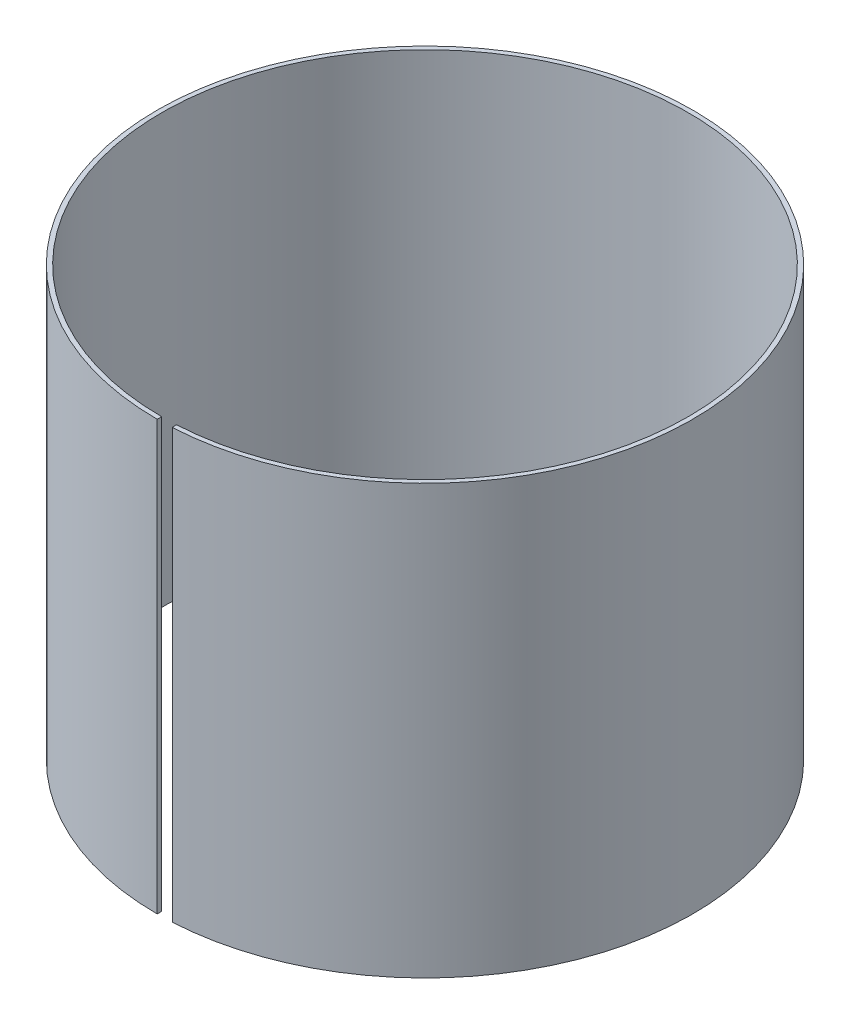
ISO-10303-21;
HEADER;
FILE_DESCRIPTION(('STEP AP214'),'2;1');
FILE_NAME('part.step','',(''),(''),'','','');
FILE_SCHEMA(('AUTOMOTIVE_DESIGN { 1 0 10303 214 1 1 1 1 }'));
ENDSEC;
DATA;
#1=APPLICATION_CONTEXT('core data for automotive mechanical design processes');
#2=APPLICATION_PROTOCOL_DEFINITION('international standard','automotive_design',2000,#1);
#3=PRODUCT_CONTEXT('',#1,'mechanical');
#4=PRODUCT('Part','Part','',(#3));
#5=PRODUCT_RELATED_PRODUCT_CATEGORY('part','',(#4));
#6=PRODUCT_DEFINITION_FORMATION('','',#4);
#7=PRODUCT_DEFINITION_CONTEXT('part definition',#1,'design');
#8=PRODUCT_DEFINITION('design','',#6,#7);
#9=PRODUCT_DEFINITION_SHAPE('','',#8);
#10=(LENGTH_UNIT() NAMED_UNIT(*) SI_UNIT(.MILLI.,.METRE.));
#11=(NAMED_UNIT(*) PLANE_ANGLE_UNIT() SI_UNIT($,.RADIAN.));
#12=(NAMED_UNIT(*) SI_UNIT($,.STERADIAN.) SOLID_ANGLE_UNIT());
#13=UNCERTAINTY_MEASURE_WITH_UNIT(LENGTH_MEASURE(1.E-05),#10,'distance_accuracy_value','');
#14=(GEOMETRIC_REPRESENTATION_CONTEXT(3) GLOBAL_UNCERTAINTY_ASSIGNED_CONTEXT((#13)) GLOBAL_UNIT_ASSIGNED_CONTEXT((#10,
#11,#12)) REPRESENTATION_CONTEXT('',''));
#15=CARTESIAN_POINT('',(0.,0.,0.));
#16=DIRECTION('',(0.,0.,1.));
#17=DIRECTION('',(1.,0.,0.));
#18=AXIS2_PLACEMENT_3D('',#15,#16,#17);
#19=CARTESIAN_POINT('',(0.,48.,0.));
#20=DIRECTION('',(0.,-1.,0.));
#21=DIRECTION('',(0.,0.,-1.));
#22=AXIS2_PLACEMENT_3D('',#19,#20,#21);
#23=CYLINDRICAL_SURFACE('',#22,29.5);
#24=CARTESIAN_POINT('',(0.,0.,0.));
#25=DIRECTION('',(0.,-1.,0.));
#26=DIRECTION('',(0.,0.,-1.));
#27=AXIS2_PLACEMENT_3D('',#24,#25,#26);
#28=CIRCLE('',#27,29.5);
#29=CARTESIAN_POINT('',(0.,0.,29.5));
#30=VERTEX_POINT('',#29);
#31=CARTESIAN_POINT('',(1.61210984911589,0.,29.4559179424846));
#32=VERTEX_POINT('',#31);
#33=EDGE_CURVE('E96',#30,#32,#28,.T.);
#34=ORIENTED_EDGE('',*,*,#33,.T.);
#35=DIRECTION('',(0.,-1.,0.));
#36=VECTOR('',#35,1.);
#37=CARTESIAN_POINT('',(1.61210984911589,48.,29.4559179424846));
#38=LINE('',#37,#36);
#39=CARTESIAN_POINT('',(1.61210984911589,48.,29.4559179424846));
#40=VERTEX_POINT('',#39);
#41=EDGE_CURVE('E11',#40,#32,#38,.T.);
#42=ORIENTED_EDGE('',*,*,#41,.F.);
#43=CARTESIAN_POINT('',(0.,48.,0.));
#44=DIRECTION('',(0.,-1.,0.));
#45=DIRECTION('',(0.,0.,-1.));
#46=AXIS2_PLACEMENT_3D('',#43,#44,#45);
#47=CIRCLE('',#46,29.5);
#48=CARTESIAN_POINT('',(0.,48.,29.5));
#49=VERTEX_POINT('',#48);
#50=EDGE_CURVE('E73',#49,#40,#47,.T.);
#51=ORIENTED_EDGE('',*,*,#50,.F.);
#52=DIRECTION('',(0.,-1.,0.));
#53=VECTOR('',#52,1.);
#54=CARTESIAN_POINT('',(0.,48.,29.5));
#55=LINE('',#54,#53);
#56=EDGE_CURVE('E49',#49,#30,#55,.T.);
#57=ORIENTED_EDGE('',*,*,#56,.T.);
#58=EDGE_LOOP('',(#34,#42,#51,#57));
#59=FACE_BOUND('',#58,.T.);
#60=ADVANCED_FACE('F33',(#59),#23,.F.);
#61=CARTESIAN_POINT('',(1.63943374486361,48.,29.9551707889673));
#62=DIRECTION('',(-0.998505692965579,0.,0.0546477914954358));
#63=DIRECTION('',(0.0546477914954358,0.,0.998505692965579));
#64=AXIS2_PLACEMENT_3D('',#61,#62,#63);
#65=PLANE('',#64);
#66=DIRECTION('',(-0.0546477914954358,0.,-0.998505692965579));
#67=VECTOR('',#66,1.);
#68=CARTESIAN_POINT('',(1.63943374486361,0.,29.9551707889673));
#69=LINE('',#68,#67);
#70=CARTESIAN_POINT('',(1.63943374486361,0.,29.9551707889673));
#71=VERTEX_POINT('',#70);
#72=EDGE_CURVE('E82',#71,#32,#69,.T.);
#73=ORIENTED_EDGE('',*,*,#72,.F.);
#74=DIRECTION('',(0.,-1.,0.));
#75=VECTOR('',#74,1.);
#76=CARTESIAN_POINT('',(1.63943374486361,48.,29.9551707889673));
#77=LINE('',#76,#75);
#78=CARTESIAN_POINT('',(1.63943374486361,48.,29.9551707889673));
#79=VERTEX_POINT('',#78);
#80=EDGE_CURVE('E41',#79,#71,#77,.T.);
#81=ORIENTED_EDGE('',*,*,#80,.F.);
#82=DIRECTION('',(-0.0546477914954358,0.,-0.998505692965579));
#83=VECTOR('',#82,1.);
#84=CARTESIAN_POINT('',(1.63943374486361,48.,29.9551707889673));
#85=LINE('',#84,#83);
#86=EDGE_CURVE('E80',#79,#40,#85,.T.);
#87=ORIENTED_EDGE('',*,*,#86,.T.);
#88=ORIENTED_EDGE('',*,*,#41,.T.);
#89=EDGE_LOOP('',(#73,#81,#87,#88));
#90=FACE_BOUND('',#89,.T.);
#91=ADVANCED_FACE('F79',(#90),#65,.T.);
#92=CARTESIAN_POINT('',(0.,48.,0.));
#93=DIRECTION('',(0.,-1.,0.));
#94=DIRECTION('',(0.,0.,-1.));
#95=AXIS2_PLACEMENT_3D('',#92,#93,#94);
#96=CYLINDRICAL_SURFACE('',#95,30.);
#97=CARTESIAN_POINT('',(0.,0.,0.));
#98=DIRECTION('',(0.,1.,0.));
#99=DIRECTION('',(1.,0.,0.));
#100=AXIS2_PLACEMENT_3D('',#97,#98,#99);
#101=CIRCLE('',#100,30.);
#102=CARTESIAN_POINT('',(0.,0.,30.));
#103=VERTEX_POINT('',#102);
#104=EDGE_CURVE('E99',#103,#71,#101,.F.);
#105=ORIENTED_EDGE('',*,*,#104,.F.);
#106=DIRECTION('',(0.,-1.,0.));
#107=VECTOR('',#106,1.);
#108=CARTESIAN_POINT('',(0.,48.,30.));
#109=LINE('',#108,#107);
#110=CARTESIAN_POINT('',(0.,48.,30.));
#111=VERTEX_POINT('',#110);
#112=EDGE_CURVE('E62',#111,#103,#109,.T.);
#113=ORIENTED_EDGE('',*,*,#112,.F.);
#114=CARTESIAN_POINT('',(0.,48.,0.));
#115=DIRECTION('',(0.,1.,0.));
#116=DIRECTION('',(1.,0.,0.));
#117=AXIS2_PLACEMENT_3D('',#114,#115,#116);
#118=CIRCLE('',#117,30.);
#119=EDGE_CURVE('E88',#111,#79,#118,.F.);
#120=ORIENTED_EDGE('',*,*,#119,.T.);
#121=ORIENTED_EDGE('',*,*,#80,.T.);
#122=EDGE_LOOP('',(#105,#113,#120,#121));
#123=FACE_BOUND('',#122,.T.);
#124=ADVANCED_FACE('F90',(#123),#96,.T.);
#125=CARTESIAN_POINT('',(0.,48.,29.5));
#126=DIRECTION('',(1.,0.,0.));
#127=DIRECTION('',(0.,0.,-1.));
#128=AXIS2_PLACEMENT_3D('',#125,#126,#127);
#129=PLANE('',#128);
#130=DIRECTION('',(0.,0.,1.));
#131=VECTOR('',#130,1.);
#132=CARTESIAN_POINT('',(0.,0.,29.5));
#133=LINE('',#132,#131);
#134=EDGE_CURVE('E101',#30,#103,#133,.T.);
#135=ORIENTED_EDGE('',*,*,#134,.F.);
#136=ORIENTED_EDGE('',*,*,#56,.F.);
#137=DIRECTION('',(0.,0.,1.));
#138=VECTOR('',#137,1.);
#139=CARTESIAN_POINT('',(0.,48.,29.5));
#140=LINE('',#139,#138);
#141=EDGE_CURVE('E91',#49,#111,#140,.T.);
#142=ORIENTED_EDGE('',*,*,#141,.T.);
#143=ORIENTED_EDGE('',*,*,#112,.T.);
#144=EDGE_LOOP('',(#135,#136,#142,#143));
#145=FACE_BOUND('',#144,.T.);
#146=ADVANCED_FACE('F107',(#145),#129,.T.);
#147=CARTESIAN_POINT('',(0.,48.,0.));
#148=DIRECTION('',(0.,-1.,0.));
#149=DIRECTION('',(-1.,0.,0.));
#150=AXIS2_PLACEMENT_3D('',#147,#148,#149);
#151=PLANE('',#150);
#152=ORIENTED_EDGE('',*,*,#50,.T.);
#153=ORIENTED_EDGE('',*,*,#86,.F.);
#154=ORIENTED_EDGE('',*,*,#119,.F.);
#155=ORIENTED_EDGE('',*,*,#141,.F.);
#156=EDGE_LOOP('',(#152,#153,#154,#155));
#157=FACE_BOUND('',#156,.T.);
#158=ADVANCED_FACE('F87',(#157),#151,.F.);
#159=CARTESIAN_POINT('',(0.,0.,0.));
#160=DIRECTION('',(0.,-1.,0.));
#161=DIRECTION('',(-1.,0.,0.));
#162=AXIS2_PLACEMENT_3D('',#159,#160,#161);
#163=PLANE('',#162);
#164=ORIENTED_EDGE('',*,*,#33,.F.);
#165=ORIENTED_EDGE('',*,*,#134,.T.);
#166=ORIENTED_EDGE('',*,*,#104,.T.);
#167=ORIENTED_EDGE('',*,*,#72,.T.);
#168=EDGE_LOOP('',(#164,#165,#166,#167));
#169=FACE_BOUND('',#168,.T.);
#170=ADVANCED_FACE('F106',(#169),#163,.T.);
#171=CLOSED_SHELL('',(#60,#91,#124,#146,#158,#170));
#172=MANIFOLD_SOLID_BREP('B2',#171);
#173=ADVANCED_BREP_SHAPE_REPRESENTATION('',(#18,#172),#14);
#174=SHAPE_DEFINITION_REPRESENTATION(#9,#173);
ENDSEC;
END-ISO-10303-21;
